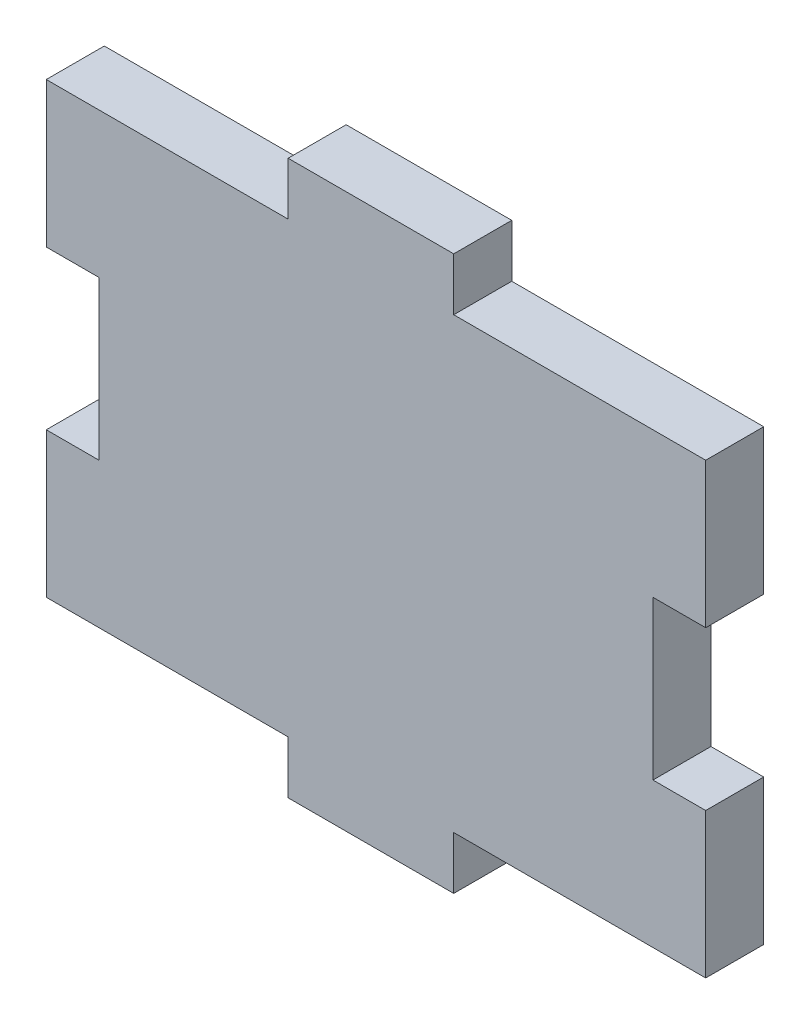
ISO-10303-21;
HEADER;
FILE_DESCRIPTION(('STEP AP214'),'2;1');
FILE_NAME('part.step','',(''),(''),'','','');
FILE_SCHEMA(('AUTOMOTIVE_DESIGN { 1 0 10303 214 1 1 1 1 }'));
ENDSEC;
DATA;
#1=APPLICATION_CONTEXT('core data for automotive mechanical design processes');
#2=APPLICATION_PROTOCOL_DEFINITION('international standard','automotive_design',2000,#1);
#3=PRODUCT_CONTEXT('',#1,'mechanical');
#4=PRODUCT('Part','Part','',(#3));
#5=PRODUCT_RELATED_PRODUCT_CATEGORY('part','',(#4));
#6=PRODUCT_DEFINITION_FORMATION('','',#4);
#7=PRODUCT_DEFINITION_CONTEXT('part definition',#1,'design');
#8=PRODUCT_DEFINITION('design','',#6,#7);
#9=PRODUCT_DEFINITION_SHAPE('','',#8);
#10=(LENGTH_UNIT() NAMED_UNIT(*) SI_UNIT(.MILLI.,.METRE.));
#11=(NAMED_UNIT(*) PLANE_ANGLE_UNIT() SI_UNIT($,.RADIAN.));
#12=(NAMED_UNIT(*) SI_UNIT($,.STERADIAN.) SOLID_ANGLE_UNIT());
#13=UNCERTAINTY_MEASURE_WITH_UNIT(LENGTH_MEASURE(1.E-05),#10,'distance_accuracy_value','');
#14=(GEOMETRIC_REPRESENTATION_CONTEXT(3) GLOBAL_UNCERTAINTY_ASSIGNED_CONTEXT((#13)) GLOBAL_UNIT_ASSIGNED_CONTEXT((#10,
#11,#12)) REPRESENTATION_CONTEXT('',''));
#15=CARTESIAN_POINT('',(0.,0.,0.));
#16=DIRECTION('',(0.,0.,1.));
#17=DIRECTION('',(1.,0.,0.));
#18=AXIS2_PLACEMENT_3D('',#15,#16,#17);
#19=CARTESIAN_POINT('',(0.,21.59,5.588));
#20=DIRECTION('',(0.,-1.,0.));
#21=DIRECTION('',(0.,0.,-1.));
#22=AXIS2_PLACEMENT_3D('',#19,#20,#21);
#23=PLANE('',#22);
#24=DIRECTION('',(-1.,0.,0.));
#25=VECTOR('',#24,1.);
#26=CARTESIAN_POINT('',(0.,21.59,0.));
#27=LINE('',#26,#25);
#28=CARTESIAN_POINT('',(-8.46056093590764,21.59,0.));
#29=VERTEX_POINT('',#28);
#30=CARTESIAN_POINT('',(-31.75,21.59,0.));
#31=VERTEX_POINT('',#30);
#32=EDGE_CURVE('E260',#29,#31,#27,.T.);
#33=ORIENTED_EDGE('',*,*,#32,.T.);
#34=DIRECTION('',(0.,0.,-1.));
#35=VECTOR('',#34,1.);
#36=CARTESIAN_POINT('',(-31.75,21.59,5.588));
#37=LINE('',#36,#35);
#38=CARTESIAN_POINT('',(-31.75,21.59,5.588));
#39=VERTEX_POINT('',#38);
#40=EDGE_CURVE('E111',#39,#31,#37,.T.);
#41=ORIENTED_EDGE('',*,*,#40,.F.);
#42=DIRECTION('',(-1.,0.,0.));
#43=VECTOR('',#42,1.);
#44=CARTESIAN_POINT('',(0.,21.59,5.588));
#45=LINE('',#44,#43);
#46=CARTESIAN_POINT('',(-8.46056093590764,21.59,5.588));
#47=VERTEX_POINT('',#46);
#48=EDGE_CURVE('E216',#47,#39,#45,.T.);
#49=ORIENTED_EDGE('',*,*,#48,.F.);
#50=DIRECTION('',(0.,0.,-1.));
#51=VECTOR('',#50,1.);
#52=CARTESIAN_POINT('',(-8.46056093590764,21.59,5.588));
#53=LINE('',#52,#51);
#54=EDGE_CURVE('E209',#47,#29,#53,.T.);
#55=ORIENTED_EDGE('',*,*,#54,.T.);
#56=EDGE_LOOP('',(#33,#41,#49,#55));
#57=FACE_BOUND('',#56,.T.);
#58=ADVANCED_FACE('F101',(#57),#23,.F.);
#59=CARTESIAN_POINT('',(-31.75,0.,5.588));
#60=DIRECTION('',(1.,0.,0.));
#61=DIRECTION('',(0.,0.,-1.));
#62=AXIS2_PLACEMENT_3D('',#59,#60,#61);
#63=PLANE('',#62);
#64=DIRECTION('',(0.,-1.,0.));
#65=VECTOR('',#64,1.);
#66=CARTESIAN_POINT('',(-31.75,0.,0.));
#67=LINE('',#66,#65);
#68=CARTESIAN_POINT('',(-31.75,7.62,0.));
#69=VERTEX_POINT('',#68);
#70=EDGE_CURVE('E257',#31,#69,#67,.T.);
#71=ORIENTED_EDGE('',*,*,#70,.T.);
#72=DIRECTION('',(0.,0.,-1.));
#73=VECTOR('',#72,1.);
#74=CARTESIAN_POINT('',(-31.75,7.62,5.588));
#75=LINE('',#74,#73);
#76=CARTESIAN_POINT('',(-31.75,7.62,5.588));
#77=VERTEX_POINT('',#76);
#78=EDGE_CURVE('E165',#77,#69,#75,.T.);
#79=ORIENTED_EDGE('',*,*,#78,.F.);
#80=DIRECTION('',(0.,-1.,0.));
#81=VECTOR('',#80,1.);
#82=CARTESIAN_POINT('',(-31.75,0.,5.588));
#83=LINE('',#82,#81);
#84=EDGE_CURVE('E308',#39,#77,#83,.T.);
#85=ORIENTED_EDGE('',*,*,#84,.F.);
#86=ORIENTED_EDGE('',*,*,#40,.T.);
#87=EDGE_LOOP('',(#71,#79,#85,#86));
#88=FACE_BOUND('',#87,.T.);
#89=ADVANCED_FACE('F327',(#88),#63,.F.);
#90=CARTESIAN_POINT('',(0.,7.62,5.588));
#91=DIRECTION('',(0.,-1.,0.));
#92=DIRECTION('',(1.,0.,0.));
#93=AXIS2_PLACEMENT_3D('',#90,#91,#92);
#94=PLANE('',#93);
#95=DIRECTION('',(-1.,0.,0.));
#96=VECTOR('',#95,1.);
#97=CARTESIAN_POINT('',(0.,7.62,0.));
#98=LINE('',#97,#96);
#99=CARTESIAN_POINT('',(-26.67,7.62,0.));
#100=VERTEX_POINT('',#99);
#101=EDGE_CURVE('E254',#100,#69,#98,.T.);
#102=ORIENTED_EDGE('',*,*,#101,.F.);
#103=DIRECTION('',(0.,0.,-1.));
#104=VECTOR('',#103,1.);
#105=CARTESIAN_POINT('',(-26.67,7.62,5.588));
#106=LINE('',#105,#104);
#107=CARTESIAN_POINT('',(-26.67,7.62,5.588));
#108=VERTEX_POINT('',#107);
#109=EDGE_CURVE('E168',#108,#100,#106,.T.);
#110=ORIENTED_EDGE('',*,*,#109,.F.);
#111=DIRECTION('',(-1.,0.,0.));
#112=VECTOR('',#111,1.);
#113=CARTESIAN_POINT('',(0.,7.62,5.588));
#114=LINE('',#113,#112);
#115=EDGE_CURVE('E305',#108,#77,#114,.T.);
#116=ORIENTED_EDGE('',*,*,#115,.T.);
#117=ORIENTED_EDGE('',*,*,#78,.T.);
#118=EDGE_LOOP('',(#102,#110,#116,#117));
#119=FACE_BOUND('',#118,.T.);
#120=ADVANCED_FACE('F609',(#119),#94,.T.);
#121=CARTESIAN_POINT('',(-26.67,0.,5.588));
#122=DIRECTION('',(-1.,0.,0.));
#123=DIRECTION('',(0.,-1.,0.));
#124=AXIS2_PLACEMENT_3D('',#121,#122,#123);
#125=PLANE('',#124);
#126=DIRECTION('',(0.,1.,0.));
#127=VECTOR('',#126,1.);
#128=CARTESIAN_POINT('',(-26.67,0.,0.));
#129=LINE('',#128,#127);
#130=CARTESIAN_POINT('',(-26.67,-7.62,0.));
#131=VERTEX_POINT('',#130);
#132=EDGE_CURVE('E251',#131,#100,#129,.T.);
#133=ORIENTED_EDGE('',*,*,#132,.F.);
#134=DIRECTION('',(0.,0.,-1.));
#135=VECTOR('',#134,1.);
#136=CARTESIAN_POINT('',(-26.67,-7.62,5.588));
#137=LINE('',#136,#135);
#138=CARTESIAN_POINT('',(-26.67,-7.62,5.588));
#139=VERTEX_POINT('',#138);
#140=EDGE_CURVE('E171',#139,#131,#137,.T.);
#141=ORIENTED_EDGE('',*,*,#140,.F.);
#142=DIRECTION('',(0.,1.,0.));
#143=VECTOR('',#142,1.);
#144=CARTESIAN_POINT('',(-26.67,0.,5.588));
#145=LINE('',#144,#143);
#146=EDGE_CURVE('E302',#139,#108,#145,.T.);
#147=ORIENTED_EDGE('',*,*,#146,.T.);
#148=ORIENTED_EDGE('',*,*,#109,.T.);
#149=EDGE_LOOP('',(#133,#141,#147,#148));
#150=FACE_BOUND('',#149,.T.);
#151=ADVANCED_FACE('F599',(#150),#125,.T.);
#152=CARTESIAN_POINT('',(0.,-7.61999999999999,5.588));
#153=DIRECTION('',(0.,-1.,0.));
#154=DIRECTION('',(1.,0.,0.));
#155=AXIS2_PLACEMENT_3D('',#152,#153,#154);
#156=PLANE('',#155);
#157=DIRECTION('',(-1.,0.,0.));
#158=VECTOR('',#157,1.);
#159=CARTESIAN_POINT('',(0.,-7.61999999999999,0.));
#160=LINE('',#159,#158);
#161=CARTESIAN_POINT('',(-31.75,-7.62,0.));
#162=VERTEX_POINT('',#161);
#163=EDGE_CURVE('E248',#131,#162,#160,.T.);
#164=ORIENTED_EDGE('',*,*,#163,.T.);
#165=DIRECTION('',(0.,0.,-1.));
#166=VECTOR('',#165,1.);
#167=CARTESIAN_POINT('',(-31.75,-7.62,5.588));
#168=LINE('',#167,#166);
#169=CARTESIAN_POINT('',(-31.75,-7.62,5.588));
#170=VERTEX_POINT('',#169);
#171=EDGE_CURVE('E174',#170,#162,#168,.T.);
#172=ORIENTED_EDGE('',*,*,#171,.F.);
#173=DIRECTION('',(-1.,0.,0.));
#174=VECTOR('',#173,1.);
#175=CARTESIAN_POINT('',(0.,-7.61999999999999,5.588));
#176=LINE('',#175,#174);
#177=EDGE_CURVE('E299',#139,#170,#176,.T.);
#178=ORIENTED_EDGE('',*,*,#177,.F.);
#179=ORIENTED_EDGE('',*,*,#140,.T.);
#180=EDGE_LOOP('',(#164,#172,#178,#179));
#181=FACE_BOUND('',#180,.T.);
#182=ADVANCED_FACE('F588',(#181),#156,.F.);
#183=CARTESIAN_POINT('',(-31.75,0.,5.588));
#184=DIRECTION('',(1.,0.,0.));
#185=DIRECTION('',(0.,0.,-1.));
#186=AXIS2_PLACEMENT_3D('',#183,#184,#185);
#187=PLANE('',#186);
#188=DIRECTION('',(0.,-1.,0.));
#189=VECTOR('',#188,1.);
#190=CARTESIAN_POINT('',(-31.75,0.,0.));
#191=LINE('',#190,#189);
#192=CARTESIAN_POINT('',(-31.75,-21.59,0.));
#193=VERTEX_POINT('',#192);
#194=EDGE_CURVE('E245',#162,#193,#191,.T.);
#195=ORIENTED_EDGE('',*,*,#194,.T.);
#196=DIRECTION('',(0.,0.,-1.));
#197=VECTOR('',#196,1.);
#198=CARTESIAN_POINT('',(-31.75,-21.59,5.588));
#199=LINE('',#198,#197);
#200=CARTESIAN_POINT('',(-31.75,-21.59,5.588));
#201=VERTEX_POINT('',#200);
#202=EDGE_CURVE('E177',#201,#193,#199,.T.);
#203=ORIENTED_EDGE('',*,*,#202,.F.);
#204=DIRECTION('',(0.,-1.,0.));
#205=VECTOR('',#204,1.);
#206=CARTESIAN_POINT('',(-31.75,0.,5.588));
#207=LINE('',#206,#205);
#208=EDGE_CURVE('E296',#170,#201,#207,.T.);
#209=ORIENTED_EDGE('',*,*,#208,.F.);
#210=ORIENTED_EDGE('',*,*,#171,.T.);
#211=EDGE_LOOP('',(#195,#203,#209,#210));
#212=FACE_BOUND('',#211,.T.);
#213=ADVANCED_FACE('F578',(#212),#187,.F.);
#214=CARTESIAN_POINT('',(0.,-21.59,5.588));
#215=DIRECTION('',(0.,1.,0.));
#216=DIRECTION('',(0.,0.,1.));
#217=AXIS2_PLACEMENT_3D('',#214,#215,#216);
#218=PLANE('',#217);
#219=DIRECTION('',(1.,0.,0.));
#220=VECTOR('',#219,1.);
#221=CARTESIAN_POINT('',(0.,-21.59,0.));
#222=LINE('',#221,#220);
#223=CARTESIAN_POINT('',(-8.46056093590763,-21.59,0.));
#224=VERTEX_POINT('',#223);
#225=EDGE_CURVE('E242',#193,#224,#222,.T.);
#226=ORIENTED_EDGE('',*,*,#225,.T.);
#227=DIRECTION('',(0.,0.,-1.));
#228=VECTOR('',#227,1.);
#229=CARTESIAN_POINT('',(-8.46056093590763,-21.59,5.588));
#230=LINE('',#229,#228);
#231=CARTESIAN_POINT('',(-8.46056093590763,-21.59,5.588));
#232=VERTEX_POINT('',#231);
#233=EDGE_CURVE('E180',#232,#224,#230,.T.);
#234=ORIENTED_EDGE('',*,*,#233,.F.);
#235=DIRECTION('',(1.,0.,0.));
#236=VECTOR('',#235,1.);
#237=CARTESIAN_POINT('',(0.,-21.59,5.588));
#238=LINE('',#237,#236);
#239=EDGE_CURVE('E293',#201,#232,#238,.T.);
#240=ORIENTED_EDGE('',*,*,#239,.F.);
#241=ORIENTED_EDGE('',*,*,#202,.T.);
#242=EDGE_LOOP('',(#226,#234,#240,#241));
#243=FACE_BOUND('',#242,.T.);
#244=ADVANCED_FACE('F538',(#243),#218,.F.);
#245=CARTESIAN_POINT('',(-8.46056093590763,0.,5.588));
#246=DIRECTION('',(1.,0.,0.));
#247=DIRECTION('',(0.,0.,-1.));
#248=AXIS2_PLACEMENT_3D('',#245,#246,#247);
#249=PLANE('',#248);
#250=DIRECTION('',(0.,-1.,0.));
#251=VECTOR('',#250,1.);
#252=CARTESIAN_POINT('',(-8.46056093590763,0.,0.));
#253=LINE('',#252,#251);
#254=CARTESIAN_POINT('',(-8.46056093590763,-26.67,0.));
#255=VERTEX_POINT('',#254);
#256=EDGE_CURVE('E239',#224,#255,#253,.T.);
#257=ORIENTED_EDGE('',*,*,#256,.T.);
#258=DIRECTION('',(0.,0.,-1.));
#259=VECTOR('',#258,1.);
#260=CARTESIAN_POINT('',(-8.46056093590763,-26.67,5.588));
#261=LINE('',#260,#259);
#262=CARTESIAN_POINT('',(-8.46056093590763,-26.67,5.588));
#263=VERTEX_POINT('',#262);
#264=EDGE_CURVE('E183',#263,#255,#261,.T.);
#265=ORIENTED_EDGE('',*,*,#264,.F.);
#266=DIRECTION('',(0.,-1.,0.));
#267=VECTOR('',#266,1.);
#268=CARTESIAN_POINT('',(-8.46056093590763,0.,5.588));
#269=LINE('',#268,#267);
#270=EDGE_CURVE('E290',#232,#263,#269,.T.);
#271=ORIENTED_EDGE('',*,*,#270,.F.);
#272=ORIENTED_EDGE('',*,*,#233,.T.);
#273=EDGE_LOOP('',(#257,#265,#271,#272));
#274=FACE_BOUND('',#273,.T.);
#275=ADVANCED_FACE('F559',(#274),#249,.F.);
#276=CARTESIAN_POINT('',(0.,-26.67,5.588));
#277=DIRECTION('',(0.,1.,0.));
#278=DIRECTION('',(0.,0.,1.));
#279=AXIS2_PLACEMENT_3D('',#276,#277,#278);
#280=PLANE('',#279);
#281=DIRECTION('',(1.,0.,0.));
#282=VECTOR('',#281,1.);
#283=CARTESIAN_POINT('',(0.,-26.67,0.));
#284=LINE('',#283,#282);
#285=CARTESIAN_POINT('',(7.48569974162253,-26.67,0.));
#286=VERTEX_POINT('',#285);
#287=EDGE_CURVE('E236',#255,#286,#284,.T.);
#288=ORIENTED_EDGE('',*,*,#287,.T.);
#289=DIRECTION('',(0.,0.,-1.));
#290=VECTOR('',#289,1.);
#291=CARTESIAN_POINT('',(7.48569974162253,-26.67,5.588));
#292=LINE('',#291,#290);
#293=CARTESIAN_POINT('',(7.48569974162253,-26.67,5.588));
#294=VERTEX_POINT('',#293);
#295=EDGE_CURVE('E186',#294,#286,#292,.T.);
#296=ORIENTED_EDGE('',*,*,#295,.F.);
#297=DIRECTION('',(1.,0.,0.));
#298=VECTOR('',#297,1.);
#299=CARTESIAN_POINT('',(0.,-26.67,5.588));
#300=LINE('',#299,#298);
#301=EDGE_CURVE('E287',#263,#294,#300,.T.);
#302=ORIENTED_EDGE('',*,*,#301,.F.);
#303=ORIENTED_EDGE('',*,*,#264,.T.);
#304=EDGE_LOOP('',(#288,#296,#302,#303));
#305=FACE_BOUND('',#304,.T.);
#306=ADVANCED_FACE('F548',(#305),#280,.F.);
#307=CARTESIAN_POINT('',(7.48569974162252,0.,5.588));
#308=DIRECTION('',(1.,0.,0.));
#309=DIRECTION('',(0.,1.,0.));
#310=AXIS2_PLACEMENT_3D('',#307,#308,#309);
#311=PLANE('',#310);
#312=DIRECTION('',(0.,-1.,0.));
#313=VECTOR('',#312,1.);
#314=CARTESIAN_POINT('',(7.48569974162252,0.,0.));
#315=LINE('',#314,#313);
#316=CARTESIAN_POINT('',(7.48569974162253,-21.59,0.));
#317=VERTEX_POINT('',#316);
#318=EDGE_CURVE('E233',#317,#286,#315,.T.);
#319=ORIENTED_EDGE('',*,*,#318,.F.);
#320=DIRECTION('',(0.,0.,-1.));
#321=VECTOR('',#320,1.);
#322=CARTESIAN_POINT('',(7.48569974162253,-21.59,5.588));
#323=LINE('',#322,#321);
#324=CARTESIAN_POINT('',(7.48569974162253,-21.59,5.588));
#325=VERTEX_POINT('',#324);
#326=EDGE_CURVE('E189',#325,#317,#323,.T.);
#327=ORIENTED_EDGE('',*,*,#326,.F.);
#328=DIRECTION('',(0.,-1.,0.));
#329=VECTOR('',#328,1.);
#330=CARTESIAN_POINT('',(7.48569974162252,0.,5.588));
#331=LINE('',#330,#329);
#332=EDGE_CURVE('E284',#325,#294,#331,.T.);
#333=ORIENTED_EDGE('',*,*,#332,.T.);
#334=ORIENTED_EDGE('',*,*,#295,.T.);
#335=EDGE_LOOP('',(#319,#327,#333,#334));
#336=FACE_BOUND('',#335,.T.);
#337=ADVANCED_FACE('F536',(#336),#311,.T.);
#338=CARTESIAN_POINT('',(31.75,-21.59,0.));
#339=VERTEX_POINT('',#338);
#340=EDGE_CURVE('E136',#317,#339,#222,.T.);
#341=ORIENTED_EDGE('',*,*,#340,.T.);
#342=DIRECTION('',(0.,0.,-1.));
#343=VECTOR('',#342,1.);
#344=CARTESIAN_POINT('',(31.75,-21.59,5.588));
#345=LINE('',#344,#343);
#346=CARTESIAN_POINT('',(31.75,-21.59,5.588));
#347=VERTEX_POINT('',#346);
#348=EDGE_CURVE('E105',#347,#339,#345,.T.);
#349=ORIENTED_EDGE('',*,*,#348,.F.);
#350=EDGE_CURVE('E283',#325,#347,#238,.T.);
#351=ORIENTED_EDGE('',*,*,#350,.F.);
#352=ORIENTED_EDGE('',*,*,#326,.T.);
#353=EDGE_LOOP('',(#341,#349,#351,#352));
#354=FACE_BOUND('',#353,.T.);
#355=ADVANCED_FACE('F526',(#354),#218,.F.);
#356=CARTESIAN_POINT('',(26.67,0.,5.588));
#357=DIRECTION('',(-1.,0.,0.));
#358=DIRECTION('',(0.,0.,1.));
#359=AXIS2_PLACEMENT_3D('',#356,#357,#358);
#360=PLANE('',#359);
#361=DIRECTION('',(0.,1.,0.));
#362=VECTOR('',#361,1.);
#363=CARTESIAN_POINT('',(26.67,0.,5.588));
#364=LINE('',#363,#362);
#365=CARTESIAN_POINT('',(26.67,-7.62,5.588));
#366=VERTEX_POINT('',#365);
#367=CARTESIAN_POINT('',(26.67,7.62,5.588));
#368=VERTEX_POINT('',#367);
#369=EDGE_CURVE('E280',#366,#368,#364,.T.);
#370=ORIENTED_EDGE('',*,*,#369,.F.);
#371=DIRECTION('',(0.,0.,-1.));
#372=VECTOR('',#371,1.);
#373=CARTESIAN_POINT('',(26.67,-7.62,5.588));
#374=LINE('',#373,#372);
#375=CARTESIAN_POINT('',(26.67,-7.62,0.));
#376=VERTEX_POINT('',#375);
#377=EDGE_CURVE('E12',#366,#376,#374,.T.);
#378=ORIENTED_EDGE('',*,*,#377,.T.);
#379=DIRECTION('',(0.,1.,0.));
#380=VECTOR('',#379,1.);
#381=CARTESIAN_POINT('',(26.67,0.,0.));
#382=LINE('',#381,#380);
#383=CARTESIAN_POINT('',(26.67,7.62,0.));
#384=VERTEX_POINT('',#383);
#385=EDGE_CURVE('E157',#376,#384,#382,.T.);
#386=ORIENTED_EDGE('',*,*,#385,.T.);
#387=DIRECTION('',(0.,0.,-1.));
#388=VECTOR('',#387,1.);
#389=CARTESIAN_POINT('',(26.67,7.62,5.588));
#390=LINE('',#389,#388);
#391=EDGE_CURVE('E191',#368,#384,#390,.T.);
#392=ORIENTED_EDGE('',*,*,#391,.F.);
#393=EDGE_LOOP('',(#370,#378,#386,#392));
#394=FACE_BOUND('',#393,.T.);
#395=ADVANCED_FACE('F396',(#394),#360,.F.);
#396=CARTESIAN_POINT('',(0.,7.62,5.588));
#397=DIRECTION('',(0.,1.,0.));
#398=DIRECTION('',(-1.,0.,0.));
#399=AXIS2_PLACEMENT_3D('',#396,#397,#398);
#400=PLANE('',#399);
#401=DIRECTION('',(1.,0.,0.));
#402=VECTOR('',#401,1.);
#403=CARTESIAN_POINT('',(0.,7.62,0.));
#404=LINE('',#403,#402);
#405=CARTESIAN_POINT('',(31.75,7.62,0.));
#406=VERTEX_POINT('',#405);
#407=EDGE_CURVE('E229',#384,#406,#404,.T.);
#408=ORIENTED_EDGE('',*,*,#407,.T.);
#409=DIRECTION('',(0.,0.,-1.));
#410=VECTOR('',#409,1.);
#411=CARTESIAN_POINT('',(31.75,7.62,5.588));
#412=LINE('',#411,#410);
#413=CARTESIAN_POINT('',(31.75,7.62,5.588));
#414=VERTEX_POINT('',#413);
#415=EDGE_CURVE('E194',#414,#406,#412,.T.);
#416=ORIENTED_EDGE('',*,*,#415,.F.);
#417=DIRECTION('',(1.,0.,0.));
#418=VECTOR('',#417,1.);
#419=CARTESIAN_POINT('',(0.,7.62,5.588));
#420=LINE('',#419,#418);
#421=EDGE_CURVE('E277',#368,#414,#420,.T.);
#422=ORIENTED_EDGE('',*,*,#421,.F.);
#423=ORIENTED_EDGE('',*,*,#391,.T.);
#424=EDGE_LOOP('',(#408,#416,#422,#423));
#425=FACE_BOUND('',#424,.T.);
#426=ADVANCED_FACE('F389',(#425),#400,.F.);
#427=CARTESIAN_POINT('',(31.75,0.,5.588));
#428=DIRECTION('',(1.,0.,0.));
#429=DIRECTION('',(0.,1.,0.));
#430=AXIS2_PLACEMENT_3D('',#427,#428,#429);
#431=PLANE('',#430);
#432=DIRECTION('',(0.,-1.,0.));
#433=VECTOR('',#432,1.);
#434=CARTESIAN_POINT('',(31.75,0.,0.));
#435=LINE('',#434,#433);
#436=CARTESIAN_POINT('',(31.75,21.59,0.));
#437=VERTEX_POINT('',#436);
#438=EDGE_CURVE('E226',#437,#406,#435,.T.);
#439=ORIENTED_EDGE('',*,*,#438,.F.);
#440=DIRECTION('',(0.,0.,-1.));
#441=VECTOR('',#440,1.);
#442=CARTESIAN_POINT('',(31.75,21.59,5.588));
#443=LINE('',#442,#441);
#444=CARTESIAN_POINT('',(31.75,21.59,5.588));
#445=VERTEX_POINT('',#444);
#446=EDGE_CURVE('E197',#445,#437,#443,.T.);
#447=ORIENTED_EDGE('',*,*,#446,.F.);
#448=DIRECTION('',(0.,-1.,0.));
#449=VECTOR('',#448,1.);
#450=CARTESIAN_POINT('',(31.75,0.,5.588));
#451=LINE('',#450,#449);
#452=EDGE_CURVE('E274',#445,#414,#451,.T.);
#453=ORIENTED_EDGE('',*,*,#452,.T.);
#454=ORIENTED_EDGE('',*,*,#415,.T.);
#455=EDGE_LOOP('',(#439,#447,#453,#454));
#456=FACE_BOUND('',#455,.T.);
#457=ADVANCED_FACE('F386',(#456),#431,.T.);
#458=CARTESIAN_POINT('',(0.,21.59,5.588));
#459=DIRECTION('',(0.,1.,0.));
#460=DIRECTION('',(0.,0.,1.));
#461=AXIS2_PLACEMENT_3D('',#458,#459,#460);
#462=PLANE('',#461);
#463=DIRECTION('',(1.,0.,0.));
#464=VECTOR('',#463,1.);
#465=CARTESIAN_POINT('',(0.,21.59,0.));
#466=LINE('',#465,#464);
#467=CARTESIAN_POINT('',(7.48569974162253,21.59,0.));
#468=VERTEX_POINT('',#467);
#469=EDGE_CURVE('E223',#468,#437,#466,.T.);
#470=ORIENTED_EDGE('',*,*,#469,.F.);
#471=DIRECTION('',(0.,0.,-1.));
#472=VECTOR('',#471,1.);
#473=CARTESIAN_POINT('',(7.48569974162253,21.59,5.588));
#474=LINE('',#473,#472);
#475=CARTESIAN_POINT('',(7.48569974162253,21.59,5.588));
#476=VERTEX_POINT('',#475);
#477=EDGE_CURVE('E200',#476,#468,#474,.T.);
#478=ORIENTED_EDGE('',*,*,#477,.F.);
#479=DIRECTION('',(1.,0.,0.));
#480=VECTOR('',#479,1.);
#481=CARTESIAN_POINT('',(0.,21.59,5.588));
#482=LINE('',#481,#480);
#483=EDGE_CURVE('E271',#476,#445,#482,.T.);
#484=ORIENTED_EDGE('',*,*,#483,.T.);
#485=ORIENTED_EDGE('',*,*,#446,.T.);
#486=EDGE_LOOP('',(#470,#478,#484,#485));
#487=FACE_BOUND('',#486,.T.);
#488=ADVANCED_FACE('F377',(#487),#462,.T.);
#489=CARTESIAN_POINT('',(7.48569974162253,0.,5.588));
#490=DIRECTION('',(-1.,0.,0.));
#491=DIRECTION('',(0.,0.,1.));
#492=AXIS2_PLACEMENT_3D('',#489,#490,#491);
#493=PLANE('',#492);
#494=DIRECTION('',(0.,1.,0.));
#495=VECTOR('',#494,1.);
#496=CARTESIAN_POINT('',(7.48569974162253,0.,0.));
#497=LINE('',#496,#495);
#498=CARTESIAN_POINT('',(7.48569974162253,26.67,0.));
#499=VERTEX_POINT('',#498);
#500=EDGE_CURVE('E220',#468,#499,#497,.T.);
#501=ORIENTED_EDGE('',*,*,#500,.T.);
#502=DIRECTION('',(0.,0.,-1.));
#503=VECTOR('',#502,1.);
#504=CARTESIAN_POINT('',(7.48569974162253,26.67,5.588));
#505=LINE('',#504,#503);
#506=CARTESIAN_POINT('',(7.48569974162253,26.67,5.588));
#507=VERTEX_POINT('',#506);
#508=EDGE_CURVE('E203',#507,#499,#505,.T.);
#509=ORIENTED_EDGE('',*,*,#508,.F.);
#510=DIRECTION('',(0.,1.,0.));
#511=VECTOR('',#510,1.);
#512=CARTESIAN_POINT('',(7.48569974162253,0.,5.588));
#513=LINE('',#512,#511);
#514=EDGE_CURVE('E268',#476,#507,#513,.T.);
#515=ORIENTED_EDGE('',*,*,#514,.F.);
#516=ORIENTED_EDGE('',*,*,#477,.T.);
#517=EDGE_LOOP('',(#501,#509,#515,#516));
#518=FACE_BOUND('',#517,.T.);
#519=ADVANCED_FACE('F408',(#518),#493,.F.);
#520=CARTESIAN_POINT('',(0.,26.67,5.588));
#521=DIRECTION('',(0.,1.,0.));
#522=DIRECTION('',(0.,0.,1.));
#523=AXIS2_PLACEMENT_3D('',#520,#521,#522);
#524=PLANE('',#523);
#525=DIRECTION('',(1.,0.,0.));
#526=VECTOR('',#525,1.);
#527=CARTESIAN_POINT('',(0.,26.67,0.));
#528=LINE('',#527,#526);
#529=CARTESIAN_POINT('',(-8.46056093590764,26.67,0.));
#530=VERTEX_POINT('',#529);
#531=EDGE_CURVE('E217',#530,#499,#528,.T.);
#532=ORIENTED_EDGE('',*,*,#531,.F.);
#533=DIRECTION('',(0.,0.,-1.));
#534=VECTOR('',#533,1.);
#535=CARTESIAN_POINT('',(-8.46056093590764,26.67,5.588));
#536=LINE('',#535,#534);
#537=CARTESIAN_POINT('',(-8.46056093590764,26.67,5.588));
#538=VERTEX_POINT('',#537);
#539=EDGE_CURVE('E206',#538,#530,#536,.T.);
#540=ORIENTED_EDGE('',*,*,#539,.F.);
#541=DIRECTION('',(1.,0.,0.));
#542=VECTOR('',#541,1.);
#543=CARTESIAN_POINT('',(0.,26.67,5.588));
#544=LINE('',#543,#542);
#545=EDGE_CURVE('E265',#538,#507,#544,.T.);
#546=ORIENTED_EDGE('',*,*,#545,.T.);
#547=ORIENTED_EDGE('',*,*,#508,.T.);
#548=EDGE_LOOP('',(#532,#540,#546,#547));
#549=FACE_BOUND('',#548,.T.);
#550=ADVANCED_FACE('F370',(#549),#524,.T.);
#551=CARTESIAN_POINT('',(-8.46056093590764,0.,5.588));
#552=DIRECTION('',(-1.,0.,0.));
#553=DIRECTION('',(0.,0.,1.));
#554=AXIS2_PLACEMENT_3D('',#551,#552,#553);
#555=PLANE('',#554);
#556=DIRECTION('',(0.,1.,0.));
#557=VECTOR('',#556,1.);
#558=CARTESIAN_POINT('',(-8.46056093590764,0.,0.));
#559=LINE('',#558,#557);
#560=EDGE_CURVE('E213',#29,#530,#559,.T.);
#561=ORIENTED_EDGE('',*,*,#560,.F.);
#562=ORIENTED_EDGE('',*,*,#54,.F.);
#563=DIRECTION('',(0.,1.,0.));
#564=VECTOR('',#563,1.);
#565=CARTESIAN_POINT('',(-8.46056093590764,0.,5.588));
#566=LINE('',#565,#564);
#567=EDGE_CURVE('E212',#47,#538,#566,.T.);
#568=ORIENTED_EDGE('',*,*,#567,.T.);
#569=ORIENTED_EDGE('',*,*,#539,.T.);
#570=EDGE_LOOP('',(#561,#562,#568,#569));
#571=FACE_BOUND('',#570,.T.);
#572=ADVANCED_FACE('F365',(#571),#555,.T.);
#573=CARTESIAN_POINT('',(0.,0.,5.588));
#574=DIRECTION('',(0.,0.,1.));
#575=DIRECTION('',(1.,0.,0.));
#576=AXIS2_PLACEMENT_3D('',#573,#574,#575);
#577=PLANE('',#576);
#578=ORIENTED_EDGE('',*,*,#48,.T.);
#579=ORIENTED_EDGE('',*,*,#84,.T.);
#580=ORIENTED_EDGE('',*,*,#115,.F.);
#581=ORIENTED_EDGE('',*,*,#146,.F.);
#582=ORIENTED_EDGE('',*,*,#177,.T.);
#583=ORIENTED_EDGE('',*,*,#208,.T.);
#584=ORIENTED_EDGE('',*,*,#239,.T.);
#585=ORIENTED_EDGE('',*,*,#270,.T.);
#586=ORIENTED_EDGE('',*,*,#301,.T.);
#587=ORIENTED_EDGE('',*,*,#332,.F.);
#588=ORIENTED_EDGE('',*,*,#350,.T.);
#589=DIRECTION('',(0.,-1.,0.));
#590=VECTOR('',#589,1.);
#591=CARTESIAN_POINT('',(31.75,-7.62,5.588));
#592=LINE('',#591,#590);
#593=CARTESIAN_POINT('',(31.75,-7.62,5.588));
#594=VERTEX_POINT('',#593);
#595=EDGE_CURVE('E158',#594,#347,#592,.T.);
#596=ORIENTED_EDGE('',*,*,#595,.F.);
#597=DIRECTION('',(1.,0.,0.));
#598=VECTOR('',#597,1.);
#599=CARTESIAN_POINT('',(26.67,-7.62,5.588));
#600=LINE('',#599,#598);
#601=EDGE_CURVE('E145',#366,#594,#600,.T.);
#602=ORIENTED_EDGE('',*,*,#601,.F.);
#603=ORIENTED_EDGE('',*,*,#369,.T.);
#604=ORIENTED_EDGE('',*,*,#421,.T.);
#605=ORIENTED_EDGE('',*,*,#452,.F.);
#606=ORIENTED_EDGE('',*,*,#483,.F.);
#607=ORIENTED_EDGE('',*,*,#514,.T.);
#608=ORIENTED_EDGE('',*,*,#545,.F.);
#609=ORIENTED_EDGE('',*,*,#567,.F.);
#610=EDGE_LOOP('',(#578,#579,#580,#581,#582,#583,#584,#585,#586,#587,#588,#596,#602,#603,#604,
#605,#606,#607,#608,#609));
#611=FACE_BOUND('',#610,.T.);
#612=ADVANCED_FACE('F317',(#611),#577,.T.);
#613=CARTESIAN_POINT('',(0.,0.,0.));
#614=DIRECTION('',(0.,0.,1.));
#615=DIRECTION('',(1.,0.,0.));
#616=AXIS2_PLACEMENT_3D('',#613,#614,#615);
#617=PLANE('',#616);
#618=ORIENTED_EDGE('',*,*,#32,.F.);
#619=ORIENTED_EDGE('',*,*,#560,.T.);
#620=ORIENTED_EDGE('',*,*,#531,.T.);
#621=ORIENTED_EDGE('',*,*,#500,.F.);
#622=ORIENTED_EDGE('',*,*,#469,.T.);
#623=ORIENTED_EDGE('',*,*,#438,.T.);
#624=ORIENTED_EDGE('',*,*,#407,.F.);
#625=ORIENTED_EDGE('',*,*,#385,.F.);
#626=DIRECTION('',(1.,0.,0.));
#627=VECTOR('',#626,1.);
#628=CARTESIAN_POINT('',(26.67,-7.62,0.));
#629=LINE('',#628,#627);
#630=CARTESIAN_POINT('',(31.75,-7.62,0.));
#631=VERTEX_POINT('',#630);
#632=EDGE_CURVE('E143',#376,#631,#629,.T.);
#633=ORIENTED_EDGE('',*,*,#632,.T.);
#634=DIRECTION('',(0.,-1.,0.));
#635=VECTOR('',#634,1.);
#636=CARTESIAN_POINT('',(31.75,-7.62,0.));
#637=LINE('',#636,#635);
#638=EDGE_CURVE('E150',#631,#339,#637,.T.);
#639=ORIENTED_EDGE('',*,*,#638,.T.);
#640=ORIENTED_EDGE('',*,*,#340,.F.);
#641=ORIENTED_EDGE('',*,*,#318,.T.);
#642=ORIENTED_EDGE('',*,*,#287,.F.);
#643=ORIENTED_EDGE('',*,*,#256,.F.);
#644=ORIENTED_EDGE('',*,*,#225,.F.);
#645=ORIENTED_EDGE('',*,*,#194,.F.);
#646=ORIENTED_EDGE('',*,*,#163,.F.);
#647=ORIENTED_EDGE('',*,*,#132,.T.);
#648=ORIENTED_EDGE('',*,*,#101,.T.);
#649=ORIENTED_EDGE('',*,*,#70,.F.);
#650=EDGE_LOOP('',(#618,#619,#620,#621,#622,#623,#624,#625,#633,#639,#640,#641,#642,#643,#644,
#645,#646,#647,#648,#649));
#651=FACE_BOUND('',#650,.T.);
#652=ADVANCED_FACE('F154',(#651),#617,.F.);
#653=CARTESIAN_POINT('',(31.75,-7.62,5.588));
#654=DIRECTION('',(1.,0.,0.));
#655=DIRECTION('',(0.,0.,-1.));
#656=AXIS2_PLACEMENT_3D('',#653,#654,#655);
#657=PLANE('',#656);
#658=ORIENTED_EDGE('',*,*,#638,.F.);
#659=DIRECTION('',(0.,0.,-1.));
#660=VECTOR('',#659,1.);
#661=CARTESIAN_POINT('',(31.75,-7.62,5.588));
#662=LINE('',#661,#660);
#663=EDGE_CURVE('E139',#594,#631,#662,.T.);
#664=ORIENTED_EDGE('',*,*,#663,.F.);
#665=ORIENTED_EDGE('',*,*,#595,.T.);
#666=ORIENTED_EDGE('',*,*,#348,.T.);
#667=EDGE_LOOP('',(#658,#664,#665,#666));
#668=FACE_BOUND('',#667,.T.);
#669=ADVANCED_FACE('F103',(#668),#657,.T.);
#670=CARTESIAN_POINT('',(26.67,-7.62,5.588));
#671=DIRECTION('',(0.,1.,0.));
#672=DIRECTION('',(0.,0.,1.));
#673=AXIS2_PLACEMENT_3D('',#670,#671,#672);
#674=PLANE('',#673);
#675=ORIENTED_EDGE('',*,*,#632,.F.);
#676=ORIENTED_EDGE('',*,*,#377,.F.);
#677=ORIENTED_EDGE('',*,*,#601,.T.);
#678=ORIENTED_EDGE('',*,*,#663,.T.);
#679=EDGE_LOOP('',(#675,#676,#677,#678));
#680=FACE_BOUND('',#679,.T.);
#681=ADVANCED_FACE('F141',(#680),#674,.T.);
#682=CLOSED_SHELL('',(#58,#89,#120,#151,#182,#213,#244,#275,#306,#337,#355,#395,#426,#457,#488,
#519,#550,#572,#612,#652,#669,#681));
#683=MANIFOLD_SOLID_BREP('B2',#682);
#684=ADVANCED_BREP_SHAPE_REPRESENTATION('',(#18,#683),#14);
#685=SHAPE_DEFINITION_REPRESENTATION(#9,#684);
ENDSEC;
END-ISO-10303-21;
